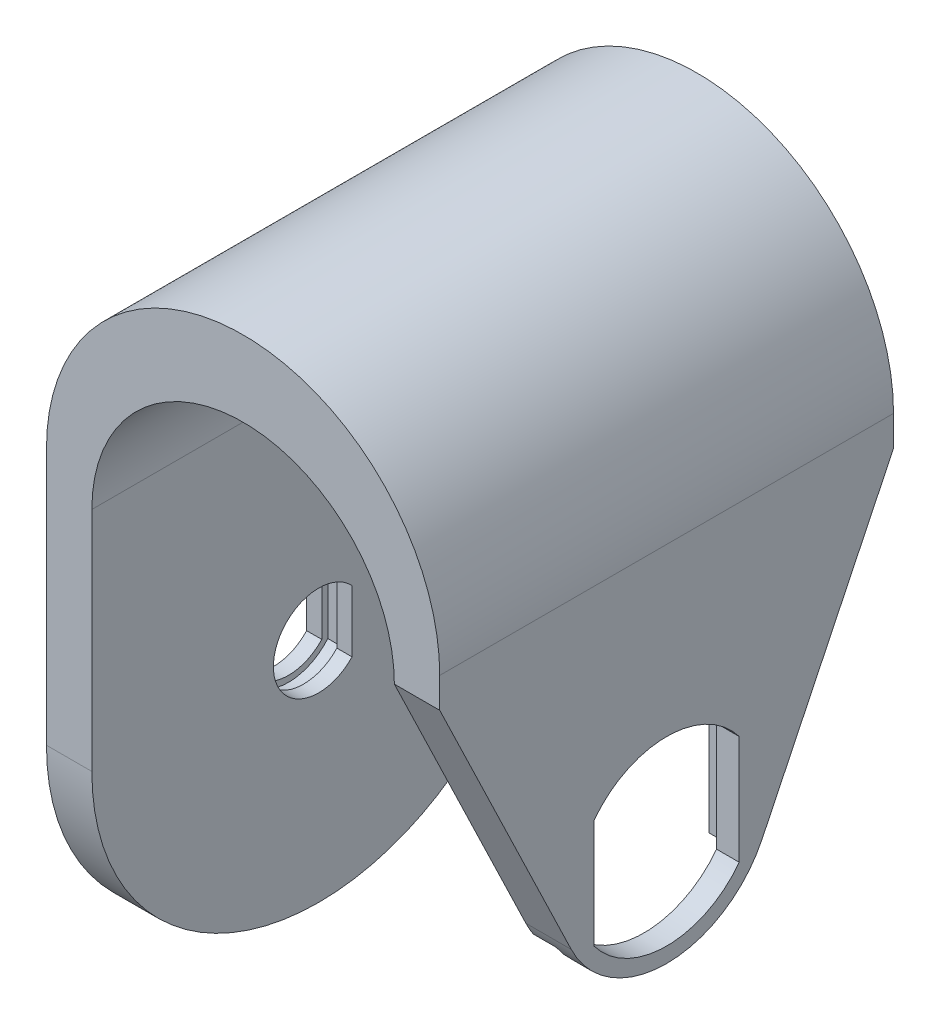
ISO-10303-21;
HEADER;
FILE_DESCRIPTION(('STEP AP214'),'2;1');
FILE_NAME('part.step','',(''),(''),'','','');
FILE_SCHEMA(('AUTOMOTIVE_DESIGN { 1 0 10303 214 1 1 1 1 }'));
ENDSEC;
DATA;
#1=APPLICATION_CONTEXT('core data for automotive mechanical design processes');
#2=APPLICATION_PROTOCOL_DEFINITION('international standard','automotive_design',2000,#1);
#3=PRODUCT_CONTEXT('',#1,'mechanical');
#4=PRODUCT('Part','Part','',(#3));
#5=PRODUCT_RELATED_PRODUCT_CATEGORY('part','',(#4));
#6=PRODUCT_DEFINITION_FORMATION('','',#4);
#7=PRODUCT_DEFINITION_CONTEXT('part definition',#1,'design');
#8=PRODUCT_DEFINITION('design','',#6,#7);
#9=PRODUCT_DEFINITION_SHAPE('','',#8);
#10=(LENGTH_UNIT() NAMED_UNIT(*) SI_UNIT(.MILLI.,.METRE.));
#11=(NAMED_UNIT(*) PLANE_ANGLE_UNIT() SI_UNIT($,.RADIAN.));
#12=(NAMED_UNIT(*) SI_UNIT($,.STERADIAN.) SOLID_ANGLE_UNIT());
#13=UNCERTAINTY_MEASURE_WITH_UNIT(LENGTH_MEASURE(1.E-05),#10,'distance_accuracy_value','');
#14=(GEOMETRIC_REPRESENTATION_CONTEXT(3) GLOBAL_UNCERTAINTY_ASSIGNED_CONTEXT((#13)) GLOBAL_UNIT_ASSIGNED_CONTEXT((#10,
#11,#12)) REPRESENTATION_CONTEXT('',''));
#15=CARTESIAN_POINT('',(0.,0.,0.));
#16=DIRECTION('',(0.,0.,1.));
#17=DIRECTION('',(1.,0.,0.));
#18=AXIS2_PLACEMENT_3D('',#15,#16,#17);
#19=CARTESIAN_POINT('',(32.501,-7.40098048640722,-5.49999999999999));
#20=DIRECTION('',(0.,0.,-1.));
#21=DIRECTION('',(0.,1.,0.));
#22=AXIS2_PLACEMENT_3D('',#19,#20,#21);
#23=PLANE('',#22);
#24=DIRECTION('',(0.,-1.,0.));
#25=VECTOR('',#24,1.);
#26=CARTESIAN_POINT('',(-30.,-7.40098048640722,-5.49999999999999));
#27=LINE('',#26,#25);
#28=CARTESIAN_POINT('',(-30.,-7.40098048640722,-5.49999999999999));
#29=VERTEX_POINT('',#28);
#30=CARTESIAN_POINT('',(-30.,-17.5990195135928,-5.49999999999999));
#31=VERTEX_POINT('',#30);
#32=EDGE_CURVE('E63',#29,#31,#27,.T.);
#33=ORIENTED_EDGE('',*,*,#32,.F.);
#34=DIRECTION('',(-1.,0.,0.));
#35=VECTOR('',#34,1.);
#36=CARTESIAN_POINT('',(32.501,-7.40098048640722,-5.49999999999999));
#37=LINE('',#36,#35);
#38=CARTESIAN_POINT('',(-32.5,-7.40098048640722,-5.49999999999999));
#39=VERTEX_POINT('',#38);
#40=EDGE_CURVE('E245',#29,#39,#37,.T.);
#41=ORIENTED_EDGE('',*,*,#40,.T.);
#42=DIRECTION('',(0.,-1.,0.));
#43=VECTOR('',#42,1.);
#44=CARTESIAN_POINT('',(-32.5,-7.40098048640722,-5.49999999999999));
#45=LINE('',#44,#43);
#46=CARTESIAN_POINT('',(-32.5,-17.5990195135928,-5.49999999999999));
#47=VERTEX_POINT('',#46);
#48=EDGE_CURVE('E234',#39,#47,#45,.T.);
#49=ORIENTED_EDGE('',*,*,#48,.T.);
#50=DIRECTION('',(-1.,0.,0.));
#51=VECTOR('',#50,1.);
#52=CARTESIAN_POINT('',(32.501,-17.5990195135928,-5.49999999999999));
#53=LINE('',#52,#51);
#54=EDGE_CURVE('E240',#31,#47,#53,.T.);
#55=ORIENTED_EDGE('',*,*,#54,.F.);
#56=EDGE_LOOP('',(#33,#41,#49,#55));
#57=FACE_BOUND('',#56,.T.);
#58=ADVANCED_FACE('F42',(#57),#23,.F.);
#59=CARTESIAN_POINT('',(32.501,-12.5,0.));
#60=DIRECTION('',(-1.,0.,0.));
#61=DIRECTION('',(0.,0.,1.));
#62=AXIS2_PLACEMENT_3D('',#59,#60,#61);
#63=CYLINDRICAL_SURFACE('',#62,7.5);
#64=ORIENTED_EDGE('',*,*,#40,.F.);
#65=CARTESIAN_POINT('',(-30.,-12.5,0.));
#66=DIRECTION('',(1.,0.,0.));
#67=DIRECTION('',(0.,0.,-1.));
#68=AXIS2_PLACEMENT_3D('',#65,#66,#67);
#69=CIRCLE('',#68,7.5);
#70=EDGE_CURVE('E11',#29,#31,#69,.T.);
#71=ORIENTED_EDGE('',*,*,#70,.T.);
#72=ORIENTED_EDGE('',*,*,#54,.T.);
#73=CARTESIAN_POINT('',(-32.5,-12.5,0.));
#74=DIRECTION('',(1.,0.,0.));
#75=DIRECTION('',(0.,0.,-1.));
#76=AXIS2_PLACEMENT_3D('',#73,#74,#75);
#77=CIRCLE('',#76,7.5);
#78=EDGE_CURVE('E237',#39,#47,#77,.T.);
#79=ORIENTED_EDGE('',*,*,#78,.F.);
#80=EDGE_LOOP('',(#64,#71,#72,#79));
#81=FACE_BOUND('',#80,.T.);
#82=ADVANCED_FACE('F417',(#81),#63,.F.);
#83=CARTESIAN_POINT('',(-32.5,-50.,37.5));
#84=DIRECTION('',(-1.,0.,0.));
#85=DIRECTION('',(0.,0.,1.));
#86=AXIS2_PLACEMENT_3D('',#83,#84,#85);
#87=PLANE('',#86);
#88=CARTESIAN_POINT('',(-32.5,-12.5,0.));
#89=DIRECTION('',(-1.,0.,0.));
#90=DIRECTION('',(0.,-1.,0.));
#91=AXIS2_PLACEMENT_3D('',#88,#89,#90);
#92=CIRCLE('',#91,37.5);
#93=CARTESIAN_POINT('',(-32.5,-12.5,-37.5));
#94=VERTEX_POINT('',#93);
#95=CARTESIAN_POINT('',(-32.5,-12.5,37.5));
#96=VERTEX_POINT('',#95);
#97=EDGE_CURVE('E313',#94,#96,#92,.T.);
#98=ORIENTED_EDGE('',*,*,#97,.T.);
#99=DIRECTION('',(0.,1.,0.));
#100=VECTOR('',#99,1.);
#101=CARTESIAN_POINT('',(-32.5,-50.,37.5));
#102=LINE('',#101,#100);
#103=CARTESIAN_POINT('',(-32.5,30.,37.5));
#104=VERTEX_POINT('',#103);
#105=EDGE_CURVE('E355',#96,#104,#102,.T.);
#106=ORIENTED_EDGE('',*,*,#105,.T.);
#107=DIRECTION('',(0.,0.,-1.));
#108=VECTOR('',#107,1.);
#109=CARTESIAN_POINT('',(-32.5,30.,37.5));
#110=LINE('',#109,#108);
#111=CARTESIAN_POINT('',(-32.5,30.,-37.5));
#112=VERTEX_POINT('',#111);
#113=EDGE_CURVE('E369',#104,#112,#110,.T.);
#114=ORIENTED_EDGE('',*,*,#113,.T.);
#115=DIRECTION('',(0.,1.,0.));
#116=VECTOR('',#115,1.);
#117=CARTESIAN_POINT('',(-32.5,-50.,-37.5));
#118=LINE('',#117,#116);
#119=EDGE_CURVE('E354',#94,#112,#118,.T.);
#120=ORIENTED_EDGE('',*,*,#119,.F.);
#121=EDGE_LOOP('',(#98,#106,#114,#120));
#122=FACE_BOUND('',#121,.T.);
#123=ORIENTED_EDGE('',*,*,#48,.F.);
#124=ORIENTED_EDGE('',*,*,#78,.T.);
#125=EDGE_LOOP('',(#123,#124));
#126=FACE_BOUND('',#125,.T.);
#127=ADVANCED_FACE('F44',(#122,#126),#87,.T.);
#128=CARTESIAN_POINT('',(-25.,25.,37.5));
#129=DIRECTION('',(1.,0.,0.));
#130=DIRECTION('',(0.,1.,0.));
#131=AXIS2_PLACEMENT_3D('',#128,#129,#130);
#132=PLANE('',#131);
#133=CARTESIAN_POINT('',(-25.,-12.5,0.));
#134=DIRECTION('',(-1.,0.,0.));
#135=DIRECTION('',(0.,-1.,0.));
#136=AXIS2_PLACEMENT_3D('',#133,#134,#135);
#137=CIRCLE('',#136,37.5);
#138=CARTESIAN_POINT('',(-25.,-12.5,-37.5));
#139=VERTEX_POINT('',#138);
#140=CARTESIAN_POINT('',(-25.,-12.5,37.5));
#141=VERTEX_POINT('',#140);
#142=EDGE_CURVE('E312',#139,#141,#137,.T.);
#143=ORIENTED_EDGE('',*,*,#142,.F.);
#144=DIRECTION('',(0.,-1.,0.));
#145=VECTOR('',#144,1.);
#146=CARTESIAN_POINT('',(-25.,25.,-37.5));
#147=LINE('',#146,#145);
#148=CARTESIAN_POINT('',(-25.,25.,-37.5));
#149=VERTEX_POINT('',#148);
#150=EDGE_CURVE('E358',#149,#139,#147,.T.);
#151=ORIENTED_EDGE('',*,*,#150,.F.);
#152=DIRECTION('',(0.,0.,-1.));
#153=VECTOR('',#152,1.);
#154=CARTESIAN_POINT('',(-25.,25.,37.5));
#155=LINE('',#154,#153);
#156=CARTESIAN_POINT('',(-25.,25.,37.5));
#157=VERTEX_POINT('',#156);
#158=EDGE_CURVE('E383',#157,#149,#155,.T.);
#159=ORIENTED_EDGE('',*,*,#158,.F.);
#160=DIRECTION('',(0.,-1.,0.));
#161=VECTOR('',#160,1.);
#162=CARTESIAN_POINT('',(-25.,25.,37.5));
#163=LINE('',#162,#161);
#164=EDGE_CURVE('E366',#157,#141,#163,.T.);
#165=ORIENTED_EDGE('',*,*,#164,.T.);
#166=EDGE_LOOP('',(#143,#151,#159,#165));
#167=FACE_BOUND('',#166,.T.);
#168=DIRECTION('',(0.,-1.,0.));
#169=VECTOR('',#168,1.);
#170=CARTESIAN_POINT('',(-25.,-7.40098048640723,-5.49999999999999));
#171=LINE('',#170,#169);
#172=CARTESIAN_POINT('',(-25.,-7.40098048640722,-5.49999999999999));
#173=VERTEX_POINT('',#172);
#174=CARTESIAN_POINT('',(-25.,-17.5990195135928,-5.49999999999999));
#175=VERTEX_POINT('',#174);
#176=EDGE_CURVE('E231',#173,#175,#171,.T.);
#177=ORIENTED_EDGE('',*,*,#176,.T.);
#178=CARTESIAN_POINT('',(-25.,-12.5,0.));
#179=DIRECTION('',(1.,0.,0.));
#180=DIRECTION('',(0.,1.,0.));
#181=AXIS2_PLACEMENT_3D('',#178,#179,#180);
#182=CIRCLE('',#181,7.5);
#183=EDGE_CURVE('E244',#173,#175,#182,.T.);
#184=ORIENTED_EDGE('',*,*,#183,.F.);
#185=EDGE_LOOP('',(#177,#184));
#186=FACE_BOUND('',#185,.T.);
#187=ADVANCED_FACE('F405',(#167,#186),#132,.T.);
#188=CARTESIAN_POINT('',(32.5,-50.,37.5));
#189=DIRECTION('',(-1.,0.,0.));
#190=DIRECTION('',(0.,0.,1.));
#191=AXIS2_PLACEMENT_3D('',#188,#189,#190);
#192=PLANE('',#191);
#193=DIRECTION('',(0.,-0.900835088341331,0.434161425754369));
#194=VECTOR('',#193,1.);
#195=CARTESIAN_POINT('',(32.5,24.9994667031742,-37.4993274725833));
#196=LINE('',#195,#194);
#197=CARTESIAN_POINT('',(32.5,24.9994667031742,-37.4993274725833));
#198=VERTEX_POINT('',#197);
#199=CARTESIAN_POINT('',(32.5,-20.0985069485922,-15.7641610778825));
#200=VERTEX_POINT('',#199);
#201=EDGE_CURVE('E327',#198,#200,#196,.T.);
#202=ORIENTED_EDGE('',*,*,#201,.F.);
#203=DIRECTION('',(0.,0.,-1.));
#204=VECTOR('',#203,1.);
#205=CARTESIAN_POINT('',(32.5,24.9994667031742,-37.4993274725833));
#206=LINE('',#205,#204);
#207=CARTESIAN_POINT('',(32.5,24.9994667031742,-37.5));
#208=VERTEX_POINT('',#207);
#209=EDGE_CURVE('E324',#198,#208,#206,.T.);
#210=ORIENTED_EDGE('',*,*,#209,.T.);
#211=DIRECTION('',(0.,1.,0.));
#212=VECTOR('',#211,1.);
#213=CARTESIAN_POINT('',(32.5,-50.,-37.5));
#214=LINE('',#213,#212);
#215=CARTESIAN_POINT('',(32.5,30.,-37.5));
#216=VERTEX_POINT('',#215);
#217=EDGE_CURVE('E374',#208,#216,#214,.T.);
#218=ORIENTED_EDGE('',*,*,#217,.T.);
#219=DIRECTION('',(0.,0.,-1.));
#220=VECTOR('',#219,1.);
#221=CARTESIAN_POINT('',(32.5,30.,37.5));
#222=LINE('',#221,#220);
#223=CARTESIAN_POINT('',(32.5,30.,37.5));
#224=VERTEX_POINT('',#223);
#225=EDGE_CURVE('E389',#224,#216,#222,.T.);
#226=ORIENTED_EDGE('',*,*,#225,.F.);
#227=DIRECTION('',(0.,1.,0.));
#228=VECTOR('',#227,1.);
#229=CARTESIAN_POINT('',(32.5,-50.,37.5));
#230=LINE('',#229,#228);
#231=CARTESIAN_POINT('',(32.5,25.,37.5));
#232=VERTEX_POINT('',#231);
#233=EDGE_CURVE('E361',#232,#224,#230,.T.);
#234=ORIENTED_EDGE('',*,*,#233,.F.);
#235=DIRECTION('',(0.,-0.900838929689562,-0.434153455307871));
#236=VECTOR('',#235,1.);
#237=CARTESIAN_POINT('',(32.5,25.,37.5));
#238=LINE('',#237,#236);
#239=CARTESIAN_POINT('',(32.5,-20.0983674657728,15.765135510122));
#240=VERTEX_POINT('',#239);
#241=EDGE_CURVE('E332',#232,#240,#238,.T.);
#242=ORIENTED_EDGE('',*,*,#241,.T.);
#243=CARTESIAN_POINT('',(32.5,-12.5006816912566,0.000453604321379622));
#244=DIRECTION('',(-1.,0.,0.));
#245=DIRECTION('',(0.,-1.,0.));
#246=AXIS2_PLACEMENT_3D('',#243,#244,#245);
#247=CIRCLE('',#246,17.5000007062675);
#248=EDGE_CURVE('E330',#200,#240,#247,.T.);
#249=ORIENTED_EDGE('',*,*,#248,.F.);
#250=EDGE_LOOP('',(#202,#210,#218,#226,#234,#242,#249));
#251=FACE_BOUND('',#250,.T.);
#252=DIRECTION('',(0.,1.,0.));
#253=VECTOR('',#252,1.);
#254=CARTESIAN_POINT('',(32.5,-3.50068169125661,12.0004536043214));
#255=LINE('',#254,#253);
#256=CARTESIAN_POINT('',(32.5,-21.5006816912566,12.0004536043214));
#257=VERTEX_POINT('',#256);
#258=CARTESIAN_POINT('',(32.5,-3.50068169125662,12.0004536043214));
#259=VERTEX_POINT('',#258);
#260=EDGE_CURVE('E265',#257,#259,#255,.T.);
#261=ORIENTED_EDGE('',*,*,#260,.T.);
#262=CARTESIAN_POINT('',(32.5,-12.5006816912566,0.000453604321379622));
#263=DIRECTION('',(-1.,0.,0.));
#264=DIRECTION('',(0.,0.,1.));
#265=AXIS2_PLACEMENT_3D('',#262,#263,#264);
#266=CIRCLE('',#265,15.);
#267=CARTESIAN_POINT('',(32.5,-3.50068169125661,-11.9995463956786));
#268=VERTEX_POINT('',#267);
#269=EDGE_CURVE('E282',#268,#259,#266,.F.);
#270=ORIENTED_EDGE('',*,*,#269,.F.);
#271=DIRECTION('',(0.,1.,0.));
#272=VECTOR('',#271,1.);
#273=CARTESIAN_POINT('',(32.5,-3.50068169125661,-11.9995463956786));
#274=LINE('',#273,#272);
#275=CARTESIAN_POINT('',(32.5,-21.5006816912566,-11.9995463956786));
#276=VERTEX_POINT('',#275);
#277=EDGE_CURVE('E260',#276,#268,#274,.T.);
#278=ORIENTED_EDGE('',*,*,#277,.F.);
#279=CARTESIAN_POINT('',(32.5,-12.5006816912566,0.000453604321379622));
#280=DIRECTION('',(-1.,0.,0.));
#281=DIRECTION('',(0.,0.,1.));
#282=AXIS2_PLACEMENT_3D('',#279,#280,#281);
#283=CIRCLE('',#282,15.);
#284=EDGE_CURVE('E262',#257,#276,#283,.F.);
#285=ORIENTED_EDGE('',*,*,#284,.F.);
#286=EDGE_LOOP('',(#261,#270,#278,#285));
#287=FACE_BOUND('',#286,.T.);
#288=ADVANCED_FACE('F407',(#251,#287),#192,.F.);
#289=CARTESIAN_POINT('',(28.75,-12.5006816912566,0.000453604321379622));
#290=DIRECTION('',(-1.,0.,0.));
#291=DIRECTION('',(0.,-1.,0.));
#292=AXIS2_PLACEMENT_3D('',#289,#290,#291);
#293=PLANE('',#292);
#294=CARTESIAN_POINT('',(28.75,-12.5006816912566,0.000453604321379622));
#295=DIRECTION('',(-1.,0.,0.));
#296=DIRECTION('',(0.,-1.,0.));
#297=AXIS2_PLACEMENT_3D('',#294,#295,#296);
#298=CIRCLE('',#297,17.5000007062675);
#299=CARTESIAN_POINT('',(28.75,-2.70272145866922,14.5004536043214));
#300=VERTEX_POINT('',#299);
#301=CARTESIAN_POINT('',(28.75,-2.70272145866922,-14.4995463956786));
#302=VERTEX_POINT('',#301);
#303=EDGE_CURVE('E285',#300,#302,#298,.T.);
#304=ORIENTED_EDGE('',*,*,#303,.T.);
#305=DIRECTION('',(0.,-1.,0.));
#306=VECTOR('',#305,1.);
#307=CARTESIAN_POINT('',(28.75,-2.70272145866922,-14.4995463956786));
#308=LINE('',#307,#306);
#309=CARTESIAN_POINT('',(28.75,-22.298641923844,-14.4995463956786));
#310=VERTEX_POINT('',#309);
#311=EDGE_CURVE('E288',#302,#310,#308,.T.);
#312=ORIENTED_EDGE('',*,*,#311,.T.);
#313=CARTESIAN_POINT('',(28.75,-12.5006816912566,0.000453604321379622));
#314=DIRECTION('',(-1.,0.,0.));
#315=DIRECTION('',(0.,-1.,0.));
#316=AXIS2_PLACEMENT_3D('',#313,#314,#315);
#317=CIRCLE('',#316,17.5000007062675);
#318=CARTESIAN_POINT('',(28.75,-22.298641923844,14.5004536043214));
#319=VERTEX_POINT('',#318);
#320=EDGE_CURVE('E290',#310,#319,#317,.T.);
#321=ORIENTED_EDGE('',*,*,#320,.T.);
#322=DIRECTION('',(0.,1.,0.));
#323=VECTOR('',#322,1.);
#324=CARTESIAN_POINT('',(28.75,-2.70272145866922,14.5004536043214));
#325=LINE('',#324,#323);
#326=EDGE_CURVE('E292',#319,#300,#325,.T.);
#327=ORIENTED_EDGE('',*,*,#326,.T.);
#328=EDGE_LOOP('',(#304,#312,#321,#327));
#329=FACE_BOUND('',#328,.T.);
#330=CARTESIAN_POINT('',(28.75,-12.5006816912566,0.000453604321379622));
#331=DIRECTION('',(-1.,0.,0.));
#332=DIRECTION('',(0.,-1.,0.));
#333=AXIS2_PLACEMENT_3D('',#330,#331,#332);
#334=CIRCLE('',#333,15.);
#335=CARTESIAN_POINT('',(28.75,-3.50068169125661,-11.9995463956786));
#336=VERTEX_POINT('',#335);
#337=CARTESIAN_POINT('',(28.75,-3.50068169125662,12.0004536043214));
#338=VERTEX_POINT('',#337);
#339=EDGE_CURVE('E279',#336,#338,#334,.F.);
#340=ORIENTED_EDGE('',*,*,#339,.T.);
#341=DIRECTION('',(0.,1.,0.));
#342=VECTOR('',#341,1.);
#343=CARTESIAN_POINT('',(28.75,-3.50068169125661,12.0004536043214));
#344=LINE('',#343,#342);
#345=CARTESIAN_POINT('',(28.75,-21.5006816912566,12.0004536043214));
#346=VERTEX_POINT('',#345);
#347=EDGE_CURVE('E257',#346,#338,#344,.T.);
#348=ORIENTED_EDGE('',*,*,#347,.F.);
#349=CARTESIAN_POINT('',(28.75,-12.5006816912566,0.000453604321379622));
#350=DIRECTION('',(-1.,0.,0.));
#351=DIRECTION('',(0.,-1.,0.));
#352=AXIS2_PLACEMENT_3D('',#349,#350,#351);
#353=CIRCLE('',#352,15.);
#354=CARTESIAN_POINT('',(28.75,-21.5006816912566,-11.9995463956786));
#355=VERTEX_POINT('',#354);
#356=EDGE_CURVE('E254',#346,#355,#353,.F.);
#357=ORIENTED_EDGE('',*,*,#356,.T.);
#358=DIRECTION('',(0.,1.,0.));
#359=VECTOR('',#358,1.);
#360=CARTESIAN_POINT('',(28.75,-3.50068169125661,-11.9995463956786));
#361=LINE('',#360,#359);
#362=EDGE_CURVE('E251',#355,#336,#361,.T.);
#363=ORIENTED_EDGE('',*,*,#362,.T.);
#364=EDGE_LOOP('',(#340,#348,#357,#363));
#365=FACE_BOUND('',#364,.T.);
#366=ADVANCED_FACE('F414',(#329,#365),#293,.T.);
#367=CARTESIAN_POINT('',(0.,25.,37.5));
#368=DIRECTION('',(0.,0.,-1.));
#369=DIRECTION('',(-1.,0.,0.));
#370=AXIS2_PLACEMENT_3D('',#367,#368,#369);
#371=CYLINDRICAL_SURFACE('',#370,25.);
#372=CARTESIAN_POINT('',(0.,25.,-37.5));
#373=DIRECTION('',(0.,0.,-1.));
#374=DIRECTION('',(-1.,0.,0.));
#375=AXIS2_PLACEMENT_3D('',#372,#373,#374);
#376=CIRCLE('',#375,25.);
#377=CARTESIAN_POINT('',(25.,25.,-37.5));
#378=VERTEX_POINT('',#377);
#379=EDGE_CURVE('E379',#149,#378,#376,.T.);
#380=ORIENTED_EDGE('',*,*,#379,.T.);
#381=DIRECTION('',(0.,0.,-1.));
#382=VECTOR('',#381,1.);
#383=CARTESIAN_POINT('',(25.,25.,37.5));
#384=LINE('',#383,#382);
#385=CARTESIAN_POINT('',(25.,25.,37.5));
#386=VERTEX_POINT('',#385);
#387=EDGE_CURVE('E386',#386,#378,#384,.T.);
#388=ORIENTED_EDGE('',*,*,#387,.F.);
#389=CARTESIAN_POINT('',(0.,25.,37.5));
#390=DIRECTION('',(0.,0.,-1.));
#391=DIRECTION('',(-1.,0.,0.));
#392=AXIS2_PLACEMENT_3D('',#389,#390,#391);
#393=CIRCLE('',#392,25.);
#394=EDGE_CURVE('E363',#157,#386,#393,.T.);
#395=ORIENTED_EDGE('',*,*,#394,.F.);
#396=ORIENTED_EDGE('',*,*,#158,.T.);
#397=EDGE_LOOP('',(#380,#388,#395,#396));
#398=FACE_BOUND('',#397,.T.);
#399=ADVANCED_FACE('F455',(#398),#371,.F.);
#400=CARTESIAN_POINT('',(25.,25.,37.5));
#401=DIRECTION('',(1.,0.,0.));
#402=DIRECTION('',(0.,1.,0.));
#403=AXIS2_PLACEMENT_3D('',#400,#401,#402);
#404=PLANE('',#403);
#405=CARTESIAN_POINT('',(25.,-12.5006816912566,0.000453604321379622));
#406=DIRECTION('',(1.,0.,0.));
#407=DIRECTION('',(0.,1.,0.));
#408=AXIS2_PLACEMENT_3D('',#405,#406,#407);
#409=CIRCLE('',#408,17.5000007062675);
#410=CARTESIAN_POINT('',(25.,-2.70272145866922,-14.4995463956786));
#411=VERTEX_POINT('',#410);
#412=CARTESIAN_POINT('',(25.,-2.70272145866922,14.5004536043214));
#413=VERTEX_POINT('',#412);
#414=EDGE_CURVE('E395',#411,#413,#409,.T.);
#415=ORIENTED_EDGE('',*,*,#414,.T.);
#416=DIRECTION('',(0.,-1.,0.));
#417=VECTOR('',#416,1.);
#418=CARTESIAN_POINT('',(25.,25.,14.5004536043214));
#419=LINE('',#418,#417);
#420=CARTESIAN_POINT('',(25.,-22.298641923844,14.5004536043214));
#421=VERTEX_POINT('',#420);
#422=EDGE_CURVE('E309',#413,#421,#419,.T.);
#423=ORIENTED_EDGE('',*,*,#422,.T.);
#424=CARTESIAN_POINT('',(25.,-12.5006816912566,0.000453604321379622));
#425=DIRECTION('',(-1.,0.,0.));
#426=DIRECTION('',(0.,-1.,0.));
#427=AXIS2_PLACEMENT_3D('',#424,#425,#426);
#428=CIRCLE('',#427,17.5000007062675);
#429=CARTESIAN_POINT('',(25.,-20.0983674657728,15.765135510122));
#430=VERTEX_POINT('',#429);
#431=EDGE_CURVE('E340',#421,#430,#428,.T.);
#432=ORIENTED_EDGE('',*,*,#431,.T.);
#433=DIRECTION('',(0.,-0.900838929689562,-0.434153455307871));
#434=VECTOR('',#433,1.);
#435=CARTESIAN_POINT('',(25.,25.,37.5));
#436=LINE('',#435,#434);
#437=EDGE_CURVE('E328',#386,#430,#436,.T.);
#438=ORIENTED_EDGE('',*,*,#437,.F.);
#439=ORIENTED_EDGE('',*,*,#387,.T.);
#440=DIRECTION('',(0.,-1.,0.));
#441=VECTOR('',#440,1.);
#442=CARTESIAN_POINT('',(25.,25.,-37.5));
#443=LINE('',#442,#441);
#444=CARTESIAN_POINT('',(25.,24.9994667031742,-37.5));
#445=VERTEX_POINT('',#444);
#446=EDGE_CURVE('E376',#378,#445,#443,.T.);
#447=ORIENTED_EDGE('',*,*,#446,.T.);
#448=DIRECTION('',(0.,0.,-1.));
#449=VECTOR('',#448,1.);
#450=CARTESIAN_POINT('',(25.,24.9994667031742,-37.4993274725833));
#451=LINE('',#450,#449);
#452=CARTESIAN_POINT('',(25.,24.9994667031742,-37.4993274725833));
#453=VERTEX_POINT('',#452);
#454=EDGE_CURVE('E321',#453,#445,#451,.T.);
#455=ORIENTED_EDGE('',*,*,#454,.F.);
#456=DIRECTION('',(0.,-0.900835088341331,0.434161425754369));
#457=VECTOR('',#456,1.);
#458=CARTESIAN_POINT('',(25.,24.9994667031742,-37.4993274725833));
#459=LINE('',#458,#457);
#460=CARTESIAN_POINT('',(25.,-20.0985069485922,-15.7641610778825));
#461=VERTEX_POINT('',#460);
#462=EDGE_CURVE('E337',#453,#461,#459,.T.);
#463=ORIENTED_EDGE('',*,*,#462,.T.);
#464=CARTESIAN_POINT('',(25.,-22.298641923844,-14.4995463956786));
#465=VERTEX_POINT('',#464);
#466=EDGE_CURVE('E341',#461,#465,#428,.T.);
#467=ORIENTED_EDGE('',*,*,#466,.T.);
#468=DIRECTION('',(0.,1.,0.));
#469=VECTOR('',#468,1.);
#470=CARTESIAN_POINT('',(25.,25.,-14.4995463956786));
#471=LINE('',#470,#469);
#472=EDGE_CURVE('E299',#465,#411,#471,.T.);
#473=ORIENTED_EDGE('',*,*,#472,.T.);
#474=EDGE_LOOP('',(#415,#423,#432,#438,#439,#447,#455,#463,#467,#473));
#475=FACE_BOUND('',#474,.T.);
#476=ADVANCED_FACE('F519',(#475),#404,.F.);
#477=CARTESIAN_POINT('',(0.,30.,37.5));
#478=DIRECTION('',(0.,0.,-1.));
#479=DIRECTION('',(-1.,0.,0.));
#480=AXIS2_PLACEMENT_3D('',#477,#478,#479);
#481=CYLINDRICAL_SURFACE('',#480,32.5);
#482=CARTESIAN_POINT('',(0.,30.,-37.5));
#483=DIRECTION('',(0.,0.,-1.));
#484=DIRECTION('',(-1.,0.,0.));
#485=AXIS2_PLACEMENT_3D('',#482,#483,#484);
#486=CIRCLE('',#485,32.5);
#487=EDGE_CURVE('E371',#112,#216,#486,.T.);
#488=ORIENTED_EDGE('',*,*,#487,.F.);
#489=ORIENTED_EDGE('',*,*,#113,.F.);
#490=CARTESIAN_POINT('',(0.,30.,37.5));
#491=DIRECTION('',(0.,0.,-1.));
#492=DIRECTION('',(-1.,0.,0.));
#493=AXIS2_PLACEMENT_3D('',#490,#491,#492);
#494=CIRCLE('',#493,32.5);
#495=EDGE_CURVE('E357',#104,#224,#494,.T.);
#496=ORIENTED_EDGE('',*,*,#495,.T.);
#497=ORIENTED_EDGE('',*,*,#225,.T.);
#498=EDGE_LOOP('',(#488,#489,#496,#497));
#499=FACE_BOUND('',#498,.T.);
#500=ADVANCED_FACE('F491',(#499),#481,.T.);
#501=CARTESIAN_POINT('',(0.,30.,37.5));
#502=DIRECTION('',(0.,0.,-1.));
#503=DIRECTION('',(-1.,0.,0.));
#504=AXIS2_PLACEMENT_3D('',#501,#502,#503);
#505=PLANE('',#504);
#506=ORIENTED_EDGE('',*,*,#105,.F.);
#507=DIRECTION('',(1.,0.,0.));
#508=VECTOR('',#507,1.);
#509=CARTESIAN_POINT('',(-32.5,-12.5,37.5));
#510=LINE('',#509,#508);
#511=EDGE_CURVE('E316',#96,#141,#510,.T.);
#512=ORIENTED_EDGE('',*,*,#511,.T.);
#513=ORIENTED_EDGE('',*,*,#164,.F.);
#514=ORIENTED_EDGE('',*,*,#394,.T.);
#515=DIRECTION('',(-1.,0.,0.));
#516=VECTOR('',#515,1.);
#517=CARTESIAN_POINT('',(32.5,25.,37.5));
#518=LINE('',#517,#516);
#519=EDGE_CURVE('E335',#232,#386,#518,.T.);
#520=ORIENTED_EDGE('',*,*,#519,.F.);
#521=ORIENTED_EDGE('',*,*,#233,.T.);
#522=ORIENTED_EDGE('',*,*,#495,.F.);
#523=EDGE_LOOP('',(#506,#512,#513,#514,#520,#521,#522));
#524=FACE_BOUND('',#523,.T.);
#525=ADVANCED_FACE('F489',(#524),#505,.F.);
#526=CARTESIAN_POINT('',(0.,30.,-37.5));
#527=DIRECTION('',(0.,0.,-1.));
#528=DIRECTION('',(-1.,0.,0.));
#529=AXIS2_PLACEMENT_3D('',#526,#527,#528);
#530=PLANE('',#529);
#531=DIRECTION('',(1.,0.,0.));
#532=VECTOR('',#531,1.);
#533=CARTESIAN_POINT('',(-32.5,-12.5,-37.5));
#534=LINE('',#533,#532);
#535=EDGE_CURVE('E318',#94,#139,#534,.T.);
#536=ORIENTED_EDGE('',*,*,#535,.F.);
#537=ORIENTED_EDGE('',*,*,#119,.T.);
#538=ORIENTED_EDGE('',*,*,#487,.T.);
#539=ORIENTED_EDGE('',*,*,#217,.F.);
#540=DIRECTION('',(1.,0.,0.));
#541=VECTOR('',#540,1.);
#542=CARTESIAN_POINT('',(0.,24.9994667031742,-37.5));
#543=LINE('',#542,#541);
#544=EDGE_CURVE('E385',#445,#208,#543,.T.);
#545=ORIENTED_EDGE('',*,*,#544,.F.);
#546=ORIENTED_EDGE('',*,*,#446,.F.);
#547=ORIENTED_EDGE('',*,*,#379,.F.);
#548=ORIENTED_EDGE('',*,*,#150,.T.);
#549=EDGE_LOOP('',(#536,#537,#538,#539,#545,#546,#547,#548));
#550=FACE_BOUND('',#549,.T.);
#551=ADVANCED_FACE('F487',(#550),#530,.T.);
#552=CARTESIAN_POINT('',(32.5,24.9994667031742,-37.4993274725833));
#553=DIRECTION('',(0.,1.,0.));
#554=DIRECTION('',(-1.,0.,0.));
#555=AXIS2_PLACEMENT_3D('',#552,#553,#554);
#556=PLANE('',#555);
#557=ORIENTED_EDGE('',*,*,#544,.T.);
#558=ORIENTED_EDGE('',*,*,#209,.F.);
#559=DIRECTION('',(-1.,0.,0.));
#560=VECTOR('',#559,1.);
#561=CARTESIAN_POINT('',(32.5,24.9994667031742,-37.4993274725833));
#562=LINE('',#561,#560);
#563=EDGE_CURVE('E352',#198,#453,#562,.T.);
#564=ORIENTED_EDGE('',*,*,#563,.T.);
#565=ORIENTED_EDGE('',*,*,#454,.T.);
#566=EDGE_LOOP('',(#557,#558,#564,#565));
#567=FACE_BOUND('',#566,.T.);
#568=ADVANCED_FACE('F483',(#567),#556,.F.);
#569=CARTESIAN_POINT('',(32.5,24.9994667031742,-37.4993274725833));
#570=DIRECTION('',(0.,-0.434161425754369,-0.900835088341331));
#571=DIRECTION('',(0.,0.900835088341331,-0.434161425754369));
#572=AXIS2_PLACEMENT_3D('',#569,#570,#571);
#573=PLANE('',#572);
#574=ORIENTED_EDGE('',*,*,#462,.F.);
#575=ORIENTED_EDGE('',*,*,#563,.F.);
#576=ORIENTED_EDGE('',*,*,#201,.T.);
#577=DIRECTION('',(-1.,0.,0.));
#578=VECTOR('',#577,1.);
#579=CARTESIAN_POINT('',(32.5,-20.0985069485922,-15.7641610778825));
#580=LINE('',#579,#578);
#581=EDGE_CURVE('E350',#200,#461,#580,.T.);
#582=ORIENTED_EDGE('',*,*,#581,.T.);
#583=EDGE_LOOP('',(#574,#575,#576,#582));
#584=FACE_BOUND('',#583,.T.);
#585=ADVANCED_FACE('F479',(#584),#573,.T.);
#586=CARTESIAN_POINT('',(32.5,-12.5006816912566,0.000453604321379622));
#587=DIRECTION('',(-1.,0.,0.));
#588=DIRECTION('',(0.,-1.,0.));
#589=AXIS2_PLACEMENT_3D('',#586,#587,#588);
#590=CYLINDRICAL_SURFACE('',#589,17.5000007062675);
#591=DIRECTION('',(-1.,0.,0.));
#592=VECTOR('',#591,1.);
#593=CARTESIAN_POINT('',(28.75,-22.298641923844,14.5004536043214));
#594=LINE('',#593,#592);
#595=EDGE_CURVE('E300',#319,#421,#594,.T.);
#596=ORIENTED_EDGE('',*,*,#595,.F.);
#597=ORIENTED_EDGE('',*,*,#320,.F.);
#598=DIRECTION('',(-1.,0.,0.));
#599=VECTOR('',#598,1.);
#600=CARTESIAN_POINT('',(28.75,-22.298641923844,-14.4995463956786));
#601=LINE('',#600,#599);
#602=EDGE_CURVE('E302',#310,#465,#601,.T.);
#603=ORIENTED_EDGE('',*,*,#602,.T.);
#604=ORIENTED_EDGE('',*,*,#466,.F.);
#605=ORIENTED_EDGE('',*,*,#581,.F.);
#606=ORIENTED_EDGE('',*,*,#248,.T.);
#607=DIRECTION('',(-1.,0.,0.));
#608=VECTOR('',#607,1.);
#609=CARTESIAN_POINT('',(32.5,-20.0983674657728,15.765135510122));
#610=LINE('',#609,#608);
#611=EDGE_CURVE('E347',#240,#430,#610,.T.);
#612=ORIENTED_EDGE('',*,*,#611,.T.);
#613=ORIENTED_EDGE('',*,*,#431,.F.);
#614=EDGE_LOOP('',(#596,#597,#603,#604,#605,#606,#612,#613));
#615=FACE_BOUND('',#614,.T.);
#616=ADVANCED_FACE('F475',(#615),#590,.T.);
#617=CARTESIAN_POINT('',(32.5,25.,37.5));
#618=DIRECTION('',(0.,0.434153455307871,-0.900838929689562));
#619=DIRECTION('',(0.,0.900838929689562,0.434153455307871));
#620=AXIS2_PLACEMENT_3D('',#617,#618,#619);
#621=PLANE('',#620);
#622=ORIENTED_EDGE('',*,*,#437,.T.);
#623=ORIENTED_EDGE('',*,*,#611,.F.);
#624=ORIENTED_EDGE('',*,*,#241,.F.);
#625=ORIENTED_EDGE('',*,*,#519,.T.);
#626=EDGE_LOOP('',(#622,#623,#624,#625));
#627=FACE_BOUND('',#626,.T.);
#628=ADVANCED_FACE('F471',(#627),#621,.F.);
#629=CARTESIAN_POINT('',(-32.5,-12.5,0.));
#630=DIRECTION('',(1.,0.,0.));
#631=DIRECTION('',(0.,1.,0.));
#632=AXIS2_PLACEMENT_3D('',#629,#630,#631);
#633=CYLINDRICAL_SURFACE('',#632,37.5);
#634=ORIENTED_EDGE('',*,*,#142,.T.);
#635=ORIENTED_EDGE('',*,*,#511,.F.);
#636=ORIENTED_EDGE('',*,*,#97,.F.);
#637=ORIENTED_EDGE('',*,*,#535,.T.);
#638=EDGE_LOOP('',(#634,#635,#636,#637));
#639=FACE_BOUND('',#638,.T.);
#640=ADVANCED_FACE('F467',(#639),#633,.T.);
#641=CARTESIAN_POINT('',(28.75,-12.5006816912566,0.000453604321379622));
#642=DIRECTION('',(-1.,0.,0.));
#643=DIRECTION('',(0.,-1.,0.));
#644=AXIS2_PLACEMENT_3D('',#641,#642,#643);
#645=CYLINDRICAL_SURFACE('',#644,17.5000007062675);
#646=DIRECTION('',(-1.,0.,0.));
#647=VECTOR('',#646,1.);
#648=CARTESIAN_POINT('',(28.75,-2.70272145866922,-14.4995463956786));
#649=LINE('',#648,#647);
#650=EDGE_CURVE('E295',#302,#411,#649,.T.);
#651=ORIENTED_EDGE('',*,*,#650,.F.);
#652=ORIENTED_EDGE('',*,*,#303,.F.);
#653=DIRECTION('',(-1.,0.,0.));
#654=VECTOR('',#653,1.);
#655=CARTESIAN_POINT('',(28.75,-2.70272145866922,14.5004536043214));
#656=LINE('',#655,#654);
#657=EDGE_CURVE('E296',#300,#413,#656,.T.);
#658=ORIENTED_EDGE('',*,*,#657,.T.);
#659=ORIENTED_EDGE('',*,*,#414,.F.);
#660=EDGE_LOOP('',(#651,#652,#658,#659));
#661=FACE_BOUND('',#660,.T.);
#662=ADVANCED_FACE('F460',(#661),#645,.F.);
#663=CARTESIAN_POINT('',(28.75,-2.70272145866922,14.5004536043214));
#664=DIRECTION('',(0.,0.,1.));
#665=DIRECTION('',(1.,0.,0.));
#666=AXIS2_PLACEMENT_3D('',#663,#664,#665);
#667=PLANE('',#666);
#668=ORIENTED_EDGE('',*,*,#657,.F.);
#669=ORIENTED_EDGE('',*,*,#326,.F.);
#670=ORIENTED_EDGE('',*,*,#595,.T.);
#671=ORIENTED_EDGE('',*,*,#422,.F.);
#672=EDGE_LOOP('',(#668,#669,#670,#671));
#673=FACE_BOUND('',#672,.T.);
#674=ADVANCED_FACE('F457',(#673),#667,.F.);
#675=CARTESIAN_POINT('',(28.75,-2.70272145866922,-14.4995463956786));
#676=DIRECTION('',(0.,0.,-1.));
#677=DIRECTION('',(-1.,0.,0.));
#678=AXIS2_PLACEMENT_3D('',#675,#676,#677);
#679=PLANE('',#678);
#680=ORIENTED_EDGE('',*,*,#602,.F.);
#681=ORIENTED_EDGE('',*,*,#311,.F.);
#682=ORIENTED_EDGE('',*,*,#650,.T.);
#683=ORIENTED_EDGE('',*,*,#472,.F.);
#684=EDGE_LOOP('',(#680,#681,#682,#683));
#685=FACE_BOUND('',#684,.T.);
#686=ADVANCED_FACE('F451',(#685),#679,.F.);
#687=CARTESIAN_POINT('',(32.501,-3.50068169125661,12.0004536043214));
#688=DIRECTION('',(0.,0.,-1.));
#689=DIRECTION('',(-1.,0.,0.));
#690=AXIS2_PLACEMENT_3D('',#687,#688,#689);
#691=PLANE('',#690);
#692=DIRECTION('',(-1.,0.,0.));
#693=VECTOR('',#692,1.);
#694=CARTESIAN_POINT('',(32.501,-21.5006816912566,12.0004536043214));
#695=LINE('',#694,#693);
#696=EDGE_CURVE('E276',#257,#346,#695,.T.);
#697=ORIENTED_EDGE('',*,*,#696,.T.);
#698=ORIENTED_EDGE('',*,*,#347,.T.);
#699=DIRECTION('',(-1.,0.,0.));
#700=VECTOR('',#699,1.);
#701=CARTESIAN_POINT('',(32.501,-3.50068169125662,12.0004536043214));
#702=LINE('',#701,#700);
#703=EDGE_CURVE('E268',#259,#338,#702,.T.);
#704=ORIENTED_EDGE('',*,*,#703,.F.);
#705=ORIENTED_EDGE('',*,*,#260,.F.);
#706=EDGE_LOOP('',(#697,#698,#704,#705));
#707=FACE_BOUND('',#706,.T.);
#708=ADVANCED_FACE('F447',(#707),#691,.T.);
#709=CARTESIAN_POINT('',(32.501,-12.5006816912566,0.000453604321379622));
#710=DIRECTION('',(-1.,0.,0.));
#711=DIRECTION('',(0.,-1.,0.));
#712=AXIS2_PLACEMENT_3D('',#709,#710,#711);
#713=CYLINDRICAL_SURFACE('',#712,15.);
#714=ORIENTED_EDGE('',*,*,#284,.T.);
#715=DIRECTION('',(-1.,0.,0.));
#716=VECTOR('',#715,1.);
#717=CARTESIAN_POINT('',(32.501,-21.5006816912566,-11.9995463956786));
#718=LINE('',#717,#716);
#719=EDGE_CURVE('E273',#276,#355,#718,.T.);
#720=ORIENTED_EDGE('',*,*,#719,.T.);
#721=ORIENTED_EDGE('',*,*,#356,.F.);
#722=ORIENTED_EDGE('',*,*,#696,.F.);
#723=EDGE_LOOP('',(#714,#720,#721,#722));
#724=FACE_BOUND('',#723,.T.);
#725=ADVANCED_FACE('F441',(#724),#713,.F.);
#726=CARTESIAN_POINT('',(32.501,-3.50068169125661,-11.9995463956786));
#727=DIRECTION('',(0.,0.,-1.));
#728=DIRECTION('',(-1.,0.,0.));
#729=AXIS2_PLACEMENT_3D('',#726,#727,#728);
#730=PLANE('',#729);
#731=ORIENTED_EDGE('',*,*,#277,.T.);
#732=DIRECTION('',(-1.,0.,0.));
#733=VECTOR('',#732,1.);
#734=CARTESIAN_POINT('',(32.501,-3.50068169125661,-11.9995463956786));
#735=LINE('',#734,#733);
#736=EDGE_CURVE('E270',#268,#336,#735,.T.);
#737=ORIENTED_EDGE('',*,*,#736,.T.);
#738=ORIENTED_EDGE('',*,*,#362,.F.);
#739=ORIENTED_EDGE('',*,*,#719,.F.);
#740=EDGE_LOOP('',(#731,#737,#738,#739));
#741=FACE_BOUND('',#740,.T.);
#742=ADVANCED_FACE('F436',(#741),#730,.F.);
#743=CARTESIAN_POINT('',(32.501,-12.5006816912566,0.000453604321379622));
#744=DIRECTION('',(-1.,0.,0.));
#745=DIRECTION('',(0.,-1.,0.));
#746=AXIS2_PLACEMENT_3D('',#743,#744,#745);
#747=CYLINDRICAL_SURFACE('',#746,15.);
#748=ORIENTED_EDGE('',*,*,#269,.T.);
#749=ORIENTED_EDGE('',*,*,#703,.T.);
#750=ORIENTED_EDGE('',*,*,#339,.F.);
#751=ORIENTED_EDGE('',*,*,#736,.F.);
#752=EDGE_LOOP('',(#748,#749,#750,#751));
#753=FACE_BOUND('',#752,.T.);
#754=ADVANCED_FACE('F431',(#753),#747,.F.);
#755=CARTESIAN_POINT('',(-27.5,-7.40098048640722,-5.49999999999999));
#756=VERTEX_POINT('',#755);
#757=EDGE_CURVE('E241',#173,#756,#37,.T.);
#758=ORIENTED_EDGE('',*,*,#757,.T.);
#759=DIRECTION('',(0.,-1.,0.));
#760=VECTOR('',#759,1.);
#761=CARTESIAN_POINT('',(-27.5,-7.40098048640722,-5.49999999999999));
#762=LINE('',#761,#760);
#763=CARTESIAN_POINT('',(-27.5,-17.5990195135928,-5.49999999999999));
#764=VERTEX_POINT('',#763);
#765=EDGE_CURVE('E56',#756,#764,#762,.T.);
#766=ORIENTED_EDGE('',*,*,#765,.T.);
#767=EDGE_CURVE('E246',#175,#764,#53,.T.);
#768=ORIENTED_EDGE('',*,*,#767,.F.);
#769=ORIENTED_EDGE('',*,*,#176,.F.);
#770=EDGE_LOOP('',(#758,#766,#768,#769));
#771=FACE_BOUND('',#770,.T.);
#772=ADVANCED_FACE('F401',(#771),#23,.F.);
#773=CARTESIAN_POINT('',(-27.5,-12.5,0.));
#774=DIRECTION('',(1.,0.,0.));
#775=DIRECTION('',(0.,0.,-1.));
#776=AXIS2_PLACEMENT_3D('',#773,#774,#775);
#777=CIRCLE('',#776,7.5);
#778=EDGE_CURVE('E50',#756,#764,#777,.T.);
#779=ORIENTED_EDGE('',*,*,#778,.F.);
#780=ORIENTED_EDGE('',*,*,#757,.F.);
#781=ORIENTED_EDGE('',*,*,#183,.T.);
#782=ORIENTED_EDGE('',*,*,#767,.T.);
#783=EDGE_LOOP('',(#779,#780,#781,#782));
#784=FACE_BOUND('',#783,.T.);
#785=ADVANCED_FACE('F402',(#784),#63,.F.);
#786=CARTESIAN_POINT('',(-30.,-12.5,0.));
#787=DIRECTION('',(1.,0.,0.));
#788=DIRECTION('',(0.,0.,-1.));
#789=AXIS2_PLACEMENT_3D('',#786,#787,#788);
#790=PLANE('',#789);
#791=CARTESIAN_POINT('',(-30.,-12.5,0.));
#792=DIRECTION('',(1.,0.,0.));
#793=DIRECTION('',(0.,0.,-1.));
#794=AXIS2_PLACEMENT_3D('',#791,#792,#793);
#795=CIRCLE('',#794,8.5);
#796=CARTESIAN_POINT('',(-30.,-7.02277442494834,-6.49999999999999));
#797=VERTEX_POINT('',#796);
#798=CARTESIAN_POINT('',(-30.,-17.9772255750517,-6.49999999999999));
#799=VERTEX_POINT('',#798);
#800=EDGE_CURVE('E208',#797,#799,#795,.T.);
#801=ORIENTED_EDGE('',*,*,#800,.T.);
#802=DIRECTION('',(0.,1.,0.));
#803=VECTOR('',#802,1.);
#804=CARTESIAN_POINT('',(-30.,-7.02277442494834,-6.49999999999999));
#805=LINE('',#804,#803);
#806=EDGE_CURVE('E217',#799,#797,#805,.T.);
#807=ORIENTED_EDGE('',*,*,#806,.T.);
#808=EDGE_LOOP('',(#801,#807));
#809=FACE_BOUND('',#808,.T.);
#810=ORIENTED_EDGE('',*,*,#32,.T.);
#811=ORIENTED_EDGE('',*,*,#70,.F.);
#812=EDGE_LOOP('',(#810,#811));
#813=FACE_BOUND('',#812,.T.);
#814=ADVANCED_FACE('F220',(#809,#813),#790,.T.);
#815=CARTESIAN_POINT('',(-27.5,-12.5,0.));
#816=DIRECTION('',(1.,0.,0.));
#817=DIRECTION('',(0.,0.,-1.));
#818=AXIS2_PLACEMENT_3D('',#815,#816,#817);
#819=PLANE('',#818);
#820=CARTESIAN_POINT('',(-27.5,-12.5,0.));
#821=DIRECTION('',(1.,0.,0.));
#822=DIRECTION('',(0.,0.,-1.));
#823=AXIS2_PLACEMENT_3D('',#820,#821,#822);
#824=CIRCLE('',#823,8.5);
#825=CARTESIAN_POINT('',(-27.5,-7.02277442494834,-6.49999999999999));
#826=VERTEX_POINT('',#825);
#827=CARTESIAN_POINT('',(-27.5,-17.9772255750517,-6.49999999999999));
#828=VERTEX_POINT('',#827);
#829=EDGE_CURVE('E211',#826,#828,#824,.T.);
#830=ORIENTED_EDGE('',*,*,#829,.F.);
#831=DIRECTION('',(0.,1.,0.));
#832=VECTOR('',#831,1.);
#833=CARTESIAN_POINT('',(-27.5,-7.02277442494834,-6.49999999999999));
#834=LINE('',#833,#832);
#835=EDGE_CURVE('E221',#828,#826,#834,.T.);
#836=ORIENTED_EDGE('',*,*,#835,.F.);
#837=EDGE_LOOP('',(#830,#836));
#838=FACE_BOUND('',#837,.T.);
#839=ORIENTED_EDGE('',*,*,#778,.T.);
#840=ORIENTED_EDGE('',*,*,#765,.F.);
#841=EDGE_LOOP('',(#839,#840));
#842=FACE_BOUND('',#841,.T.);
#843=ADVANCED_FACE('F397',(#838,#842),#819,.F.);
#844=CARTESIAN_POINT('',(-30.,-12.5,0.));
#845=DIRECTION('',(1.,0.,0.));
#846=DIRECTION('',(0.,0.,-1.));
#847=AXIS2_PLACEMENT_3D('',#844,#845,#846);
#848=CYLINDRICAL_SURFACE('',#847,8.5);
#849=ORIENTED_EDGE('',*,*,#829,.T.);
#850=DIRECTION('',(1.,0.,0.));
#851=VECTOR('',#850,1.);
#852=CARTESIAN_POINT('',(-30.,-17.9772255750517,-6.49999999999999));
#853=LINE('',#852,#851);
#854=EDGE_CURVE('E205',#799,#828,#853,.T.);
#855=ORIENTED_EDGE('',*,*,#854,.F.);
#856=ORIENTED_EDGE('',*,*,#800,.F.);
#857=DIRECTION('',(1.,0.,0.));
#858=VECTOR('',#857,1.);
#859=CARTESIAN_POINT('',(-30.,-7.02277442494834,-6.49999999999999));
#860=LINE('',#859,#858);
#861=EDGE_CURVE('E216',#797,#826,#860,.T.);
#862=ORIENTED_EDGE('',*,*,#861,.T.);
#863=EDGE_LOOP('',(#849,#855,#856,#862));
#864=FACE_BOUND('',#863,.T.);
#865=ADVANCED_FACE('F207',(#864),#848,.F.);
#866=CARTESIAN_POINT('',(-30.,-7.02277442494834,-6.49999999999999));
#867=DIRECTION('',(0.,0.,-1.));
#868=DIRECTION('',(-1.,0.,0.));
#869=AXIS2_PLACEMENT_3D('',#866,#867,#868);
#870=PLANE('',#869);
#871=ORIENTED_EDGE('',*,*,#835,.T.);
#872=ORIENTED_EDGE('',*,*,#861,.F.);
#873=ORIENTED_EDGE('',*,*,#806,.F.);
#874=ORIENTED_EDGE('',*,*,#854,.T.);
#875=EDGE_LOOP('',(#871,#872,#873,#874));
#876=FACE_BOUND('',#875,.T.);
#877=ADVANCED_FACE('F223',(#876),#870,.F.);
#878=CLOSED_SHELL('',(#58,#82,#127,#187,#288,#366,#399,#476,#500,#525,#551,#568,#585,#616,#628,
#640,#662,#674,#686,#708,#725,#742,#754,#772,#785,#814,#843,#865,#877));
#879=MANIFOLD_SOLID_BREP('B2',#878);
#880=ADVANCED_BREP_SHAPE_REPRESENTATION('',(#18,#879),#14);
#881=SHAPE_DEFINITION_REPRESENTATION(#9,#880);
ENDSEC;
END-ISO-10303-21;
